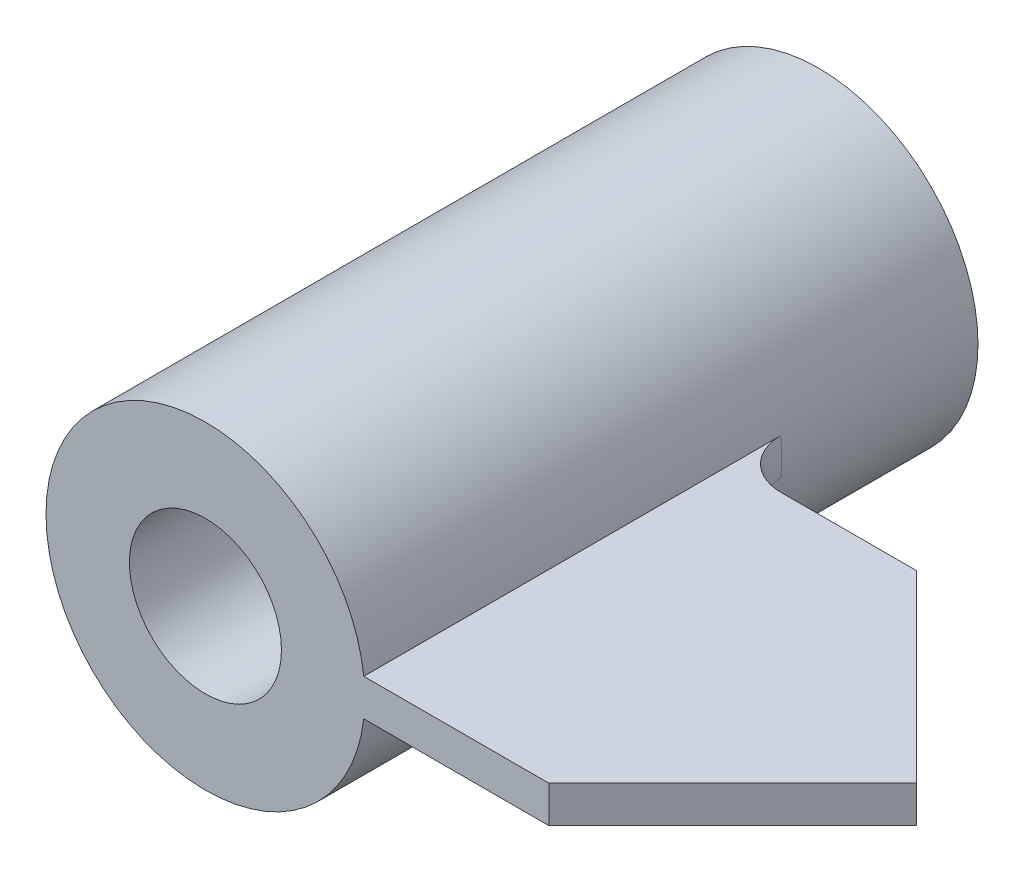
ISO-10303-21;
HEADER;
FILE_DESCRIPTION(('STEP AP214'),'2;1');
FILE_NAME('part.step','',(''),(''),'','','');
FILE_SCHEMA(('AUTOMOTIVE_DESIGN { 1 0 10303 214 1 1 1 1 }'));
ENDSEC;
DATA;
#1=APPLICATION_CONTEXT('core data for automotive mechanical design processes');
#2=APPLICATION_PROTOCOL_DEFINITION('international standard','automotive_design',2000,#1);
#3=PRODUCT_CONTEXT('',#1,'mechanical');
#4=PRODUCT('Part','Part','',(#3));
#5=PRODUCT_RELATED_PRODUCT_CATEGORY('part','',(#4));
#6=PRODUCT_DEFINITION_FORMATION('','',#4);
#7=PRODUCT_DEFINITION_CONTEXT('part definition',#1,'design');
#8=PRODUCT_DEFINITION('design','',#6,#7);
#9=PRODUCT_DEFINITION_SHAPE('','',#8);
#10=(LENGTH_UNIT() NAMED_UNIT(*) SI_UNIT(.MILLI.,.METRE.));
#11=(NAMED_UNIT(*) PLANE_ANGLE_UNIT() SI_UNIT($,.RADIAN.));
#12=(NAMED_UNIT(*) SI_UNIT($,.STERADIAN.) SOLID_ANGLE_UNIT());
#13=UNCERTAINTY_MEASURE_WITH_UNIT(LENGTH_MEASURE(1.E-05),#10,'distance_accuracy_value','');
#14=(GEOMETRIC_REPRESENTATION_CONTEXT(3) GLOBAL_UNCERTAINTY_ASSIGNED_CONTEXT((#13)) GLOBAL_UNIT_ASSIGNED_CONTEXT((#10,
#11,#12)) REPRESENTATION_CONTEXT('',''));
#15=CARTESIAN_POINT('',(0.,0.,0.));
#16=DIRECTION('',(0.,0.,1.));
#17=DIRECTION('',(1.,0.,0.));
#18=AXIS2_PLACEMENT_3D('',#15,#16,#17);
#19=CARTESIAN_POINT('',(0.,0.,55.));
#20=DIRECTION('',(0.,0.,-1.));
#21=DIRECTION('',(-1.,0.,0.));
#22=AXIS2_PLACEMENT_3D('',#19,#20,#21);
#23=CYLINDRICAL_SURFACE('',#22,6.5);
#24=CARTESIAN_POINT('',(0.,0.,63.));
#25=DIRECTION('',(0.,0.,-1.));
#26=DIRECTION('',(-1.,0.,0.));
#27=AXIS2_PLACEMENT_3D('',#24,#25,#26);
#28=CIRCLE('',#27,6.5);
#29=CARTESIAN_POINT('',(6.45659939920817,0.749882789604303,63.));
#30=VERTEX_POINT('',#29);
#31=CARTESIAN_POINT('',(6.45658578507248,-0.750000000000005,63.));
#32=VERTEX_POINT('',#31);
#33=EDGE_CURVE('E122',#30,#32,#28,.T.);
#34=ORIENTED_EDGE('',*,*,#33,.T.);
#35=DIRECTION('',(0.,0.,-1.));
#36=VECTOR('',#35,1.);
#37=CARTESIAN_POINT('',(6.45658578507248,-0.750000000000005,55.));
#38=LINE('',#37,#36);
#39=CARTESIAN_POINT('',(6.45658578507248,-0.750000000000005,80.));
#40=VERTEX_POINT('',#39);
#41=EDGE_CURVE('E106',#32,#40,#38,.F.);
#42=ORIENTED_EDGE('',*,*,#41,.T.);
#43=CARTESIAN_POINT('',(0.,0.,80.));
#44=DIRECTION('',(0.,0.,1.));
#45=DIRECTION('',(1.,0.,0.));
#46=AXIS2_PLACEMENT_3D('',#43,#44,#45);
#47=CIRCLE('',#46,6.5);
#48=CARTESIAN_POINT('',(6.45659939920817,0.749882789604303,80.));
#49=VERTEX_POINT('',#48);
#50=EDGE_CURVE('E120',#49,#40,#47,.T.);
#51=ORIENTED_EDGE('',*,*,#50,.F.);
#52=DIRECTION('',(0.,0.,-1.));
#53=VECTOR('',#52,1.);
#54=CARTESIAN_POINT('',(6.45659939920817,0.749882789604303,55.));
#55=LINE('',#54,#53);
#56=EDGE_CURVE('E123',#49,#30,#55,.T.);
#57=ORIENTED_EDGE('',*,*,#56,.T.);
#58=EDGE_LOOP('',(#34,#42,#51,#57));
#59=FACE_BOUND('',#58,.T.);
#60=CARTESIAN_POINT('',(0.,0.,55.));
#61=DIRECTION('',(0.,0.,-1.));
#62=DIRECTION('',(-1.,0.,0.));
#63=AXIS2_PLACEMENT_3D('',#60,#61,#62);
#64=CIRCLE('',#63,6.5);
#65=CARTESIAN_POINT('',(-6.5,0.,55.));
#66=VERTEX_POINT('',#65);
#67=EDGE_CURVE('E146',#66,#66,#64,.T.);
#68=ORIENTED_EDGE('',*,*,#67,.F.);
#69=EDGE_LOOP('',(#68));
#70=FACE_BOUND('',#69,.T.);
#71=ADVANCED_FACE('F46',(#59,#70),#23,.T.);
#72=CARTESIAN_POINT('',(0.,0.,80.));
#73=DIRECTION('',(0.,0.,1.));
#74=DIRECTION('',(1.,0.,0.));
#75=AXIS2_PLACEMENT_3D('',#72,#73,#74);
#76=PLANE('',#75);
#77=DIRECTION('',(1.,0.,0.));
#78=VECTOR('',#77,1.);
#79=CARTESIAN_POINT('',(21.5,-0.750000000000002,80.));
#80=LINE('',#79,#78);
#81=CARTESIAN_POINT('',(14.,-0.750000000000003,80.));
#82=VERTEX_POINT('',#81);
#83=EDGE_CURVE('E103',#40,#82,#80,.T.);
#84=ORIENTED_EDGE('',*,*,#83,.T.);
#85=DIRECTION('',(0.,1.,0.));
#86=VECTOR('',#85,1.);
#87=CARTESIAN_POINT('',(14.,0.,80.));
#88=LINE('',#87,#86);
#89=CARTESIAN_POINT('',(14.,0.749882789604304,80.));
#90=VERTEX_POINT('',#89);
#91=EDGE_CURVE('E129',#82,#90,#88,.T.);
#92=ORIENTED_EDGE('',*,*,#91,.T.);
#93=DIRECTION('',(-1.,0.,0.));
#94=VECTOR('',#93,1.);
#95=CARTESIAN_POINT('',(21.5,0.749882789604305,80.));
#96=LINE('',#95,#94);
#97=EDGE_CURVE('E113',#90,#49,#96,.T.);
#98=ORIENTED_EDGE('',*,*,#97,.T.);
#99=ORIENTED_EDGE('',*,*,#50,.T.);
#100=EDGE_LOOP('',(#84,#92,#98,#99));
#101=FACE_BOUND('',#100,.T.);
#102=CARTESIAN_POINT('',(0.,0.,80.));
#103=DIRECTION('',(0.,0.,1.));
#104=DIRECTION('',(1.,0.,0.));
#105=AXIS2_PLACEMENT_3D('',#102,#103,#104);
#106=CIRCLE('',#105,3.1);
#107=CARTESIAN_POINT('',(3.1,0.,80.));
#108=VERTEX_POINT('',#107);
#109=EDGE_CURVE('E188',#108,#108,#106,.T.);
#110=ORIENTED_EDGE('',*,*,#109,.F.);
#111=EDGE_LOOP('',(#110));
#112=FACE_BOUND('',#111,.T.);
#113=ADVANCED_FACE('F125',(#101,#112),#76,.T.);
#114=CARTESIAN_POINT('',(21.5,-0.750000000000002,65.));
#115=DIRECTION('',(0.,-1.,0.));
#116=DIRECTION('',(1.,0.,0.));
#117=AXIS2_PLACEMENT_3D('',#114,#115,#116);
#118=PLANE('',#117);
#119=DIRECTION('',(-0.707106781186549,0.,-0.707106781186547));
#120=VECTOR('',#119,1.);
#121=CARTESIAN_POINT('',(17.75,-0.750000000000003,68.75));
#122=LINE('',#121,#120);
#123=CARTESIAN_POINT('',(14.,-0.750000000000003,65.));
#124=VERTEX_POINT('',#123);
#125=CARTESIAN_POINT('',(21.5,-0.750000000000002,72.5));
#126=VERTEX_POINT('',#125);
#127=EDGE_CURVE('E138',#124,#126,#122,.F.);
#128=ORIENTED_EDGE('',*,*,#127,.T.);
#129=DIRECTION('',(0.707106781186547,0.,-0.707106781186549));
#130=VECTOR('',#129,1.);
#131=CARTESIAN_POINT('',(25.25,-0.750000000000001,68.75));
#132=LINE('',#131,#130);
#133=EDGE_CURVE('E108',#126,#82,#132,.F.);
#134=ORIENTED_EDGE('',*,*,#133,.T.);
#135=ORIENTED_EDGE('',*,*,#83,.F.);
#136=ORIENTED_EDGE('',*,*,#41,.F.);
#137=CARTESIAN_POINT('',(6.45658578507248,-0.750000000000005,63.));
#138=CARTESIAN_POINT('',(6.456585895016,-0.750000000000005,63.0560199511624));
#139=CARTESIAN_POINT('',(6.45895679287373,-0.750000000000005,63.1120129419453));
#140=CARTESIAN_POINT('',(6.46841351466681,-0.750000000000005,63.2235956415496));
#141=CARTESIAN_POINT('',(6.47549903271538,-0.750000000000005,63.2791853762978));
#142=CARTESIAN_POINT('',(6.50375284683669,-0.750000000000005,63.4446307390919));
#143=CARTESIAN_POINT('',(6.53191863347822,-0.750000000000005,63.5533739931093));
#144=CARTESIAN_POINT('',(6.60609047779167,-0.750000000000005,63.7645789486701));
#145=CARTESIAN_POINT('',(6.65210361858612,-0.750000000000005,63.8670381375206));
#146=CARTESIAN_POINT('',(6.76061749712723,-0.750000000000005,64.0628165652593));
#147=CARTESIAN_POINT('',(6.82311645382108,-0.750000000000005,64.1561367899872));
#148=CARTESIAN_POINT('',(6.96303625893643,-0.750000000000005,64.3313409786712));
#149=CARTESIAN_POINT('',(7.04050719813571,-0.750000000000005,64.4131849149133));
#150=CARTESIAN_POINT('',(7.20803612323553,-0.750000000000005,64.5628147915133));
#151=CARTESIAN_POINT('',(7.29809675944917,-0.750000000000005,64.6305977643527));
#152=CARTESIAN_POINT('',(7.48881064938792,-0.750000000000005,64.7505779035188));
#153=CARTESIAN_POINT('',(7.58952431661966,-0.750000000000004,64.802678942414));
#154=CARTESIAN_POINT('',(7.79822943150194,-0.750000000000004,64.8892755182759));
#155=CARTESIAN_POINT('',(7.90621692882678,-0.750000000000004,64.9237805255339));
#156=CARTESIAN_POINT('',(8.09015172744773,-0.750000000000004,64.9659511133814));
#157=CARTESIAN_POINT('',(8.16497154279755,-0.750000000000004,64.9787098808429));
#158=CARTESIAN_POINT('',(8.31546626925198,-0.750000000000004,64.9957336912368));
#159=CARTESIAN_POINT('',(8.3911398565467,-0.750000000000004,65.0000104414957));
#160=CARTESIAN_POINT('',(8.46684711093805,-0.750000000000004,65.));
#161=B_SPLINE_CURVE_WITH_KNOTS('',3,(#137,#138,#139,#140,#141,#142,#143,#144,#145,#146,#147,
#148,#149,#150,#151,#152,#153,#154,#155,#156,#157,#158,#159,#160),.UNSPECIFIED.,.F.,.F.,(4,2,2,
2,2,2,2,2,2,2,2,4),(0.,0.167956217268491,0.335901538520614,0.671165884098674,1.00656342321577,
1.34192474233363,1.67842811366767,2.0150024308002,2.3535997320963,2.69201460542254,
2.91926439815595,3.14620030986883),.UNSPECIFIED.);
#162=CARTESIAN_POINT('',(8.46684711093805,-0.750000000000004,65.));
#163=VERTEX_POINT('',#162);
#164=EDGE_CURVE('E60',#32,#163,#161,.T.);
#165=ORIENTED_EDGE('',*,*,#164,.T.);
#166=DIRECTION('',(1.,0.,0.));
#167=VECTOR('',#166,1.);
#168=CARTESIAN_POINT('',(21.5,-0.750000000000002,65.));
#169=LINE('',#168,#167);
#170=EDGE_CURVE('E178',#163,#124,#169,.T.);
#171=ORIENTED_EDGE('',*,*,#170,.T.);
#172=EDGE_LOOP('',(#128,#134,#135,#136,#165,#171));
#173=FACE_BOUND('',#172,.T.);
#174=ADVANCED_FACE('F105',(#173),#118,.T.);
#175=CARTESIAN_POINT('',(21.5,0.749882789604305,65.));
#176=DIRECTION('',(0.,1.,0.));
#177=DIRECTION('',(-1.,0.,0.));
#178=AXIS2_PLACEMENT_3D('',#175,#176,#177);
#179=PLANE('',#178);
#180=ORIENTED_EDGE('',*,*,#97,.F.);
#181=DIRECTION('',(-0.707106781186547,0.,0.707106781186549));
#182=VECTOR('',#181,1.);
#183=CARTESIAN_POINT('',(25.25,0.749882789604306,68.75));
#184=LINE('',#183,#182);
#185=CARTESIAN_POINT('',(21.5,0.749882789604305,72.5));
#186=VERTEX_POINT('',#185);
#187=EDGE_CURVE('E136',#90,#186,#184,.F.);
#188=ORIENTED_EDGE('',*,*,#187,.T.);
#189=DIRECTION('',(0.707106781186549,0.,0.707106781186547));
#190=VECTOR('',#189,1.);
#191=CARTESIAN_POINT('',(17.75,0.749882789604305,68.75));
#192=LINE('',#191,#190);
#193=CARTESIAN_POINT('',(14.,0.749882789604304,65.));
#194=VERTEX_POINT('',#193);
#195=EDGE_CURVE('E131',#186,#194,#192,.F.);
#196=ORIENTED_EDGE('',*,*,#195,.T.);
#197=DIRECTION('',(-1.,0.,0.));
#198=VECTOR('',#197,1.);
#199=CARTESIAN_POINT('',(21.5,0.749882789604305,65.));
#200=LINE('',#199,#198);
#201=CARTESIAN_POINT('',(8.46685749270975,0.749882789604303,65.));
#202=VERTEX_POINT('',#201);
#203=EDGE_CURVE('E180',#194,#202,#200,.T.);
#204=ORIENTED_EDGE('',*,*,#203,.T.);
#205=CARTESIAN_POINT('',(8.46685749270975,0.749882789604303,65.));
#206=CARTESIAN_POINT('',(8.41012616543038,0.749882789604303,64.9999995340136));
#207=CARTESIAN_POINT('',(8.35342214879016,0.749882789604303,64.9976034725925));
#208=CARTESIAN_POINT('',(8.24041999840883,0.749882789604303,64.9880462569389));
#209=CARTESIAN_POINT('',(8.18412184468557,0.749882789604303,64.9808853389404));
#210=CARTESIAN_POINT('',(8.01653170826635,0.749882789604303,64.9523242751285));
#211=CARTESIAN_POINT('',(7.90636214433129,0.749882789604303,64.9238456296738));
#212=CARTESIAN_POINT('',(7.69236958664806,0.749882789604303,64.8488016322939));
#213=CARTESIAN_POINT('',(7.58854962209191,0.749882789604303,64.8022277244036));
#214=CARTESIAN_POINT('',(7.39021225824501,0.749882789604303,64.6923038455143));
#215=CARTESIAN_POINT('',(7.29569316847248,0.749882789604303,64.6289569308491));
#216=CARTESIAN_POINT('',(7.11873744388704,0.749882789604303,64.4873156415015));
#217=CARTESIAN_POINT('',(7.0362912874857,0.749882789604303,64.4090331595364));
#218=CARTESIAN_POINT('',(6.88576169049443,0.749882789604303,64.2396653437029));
#219=CARTESIAN_POINT('',(6.81768087890574,0.749882789604303,64.1485776714307));
#220=CARTESIAN_POINT('',(6.6981557009222,0.749882789604303,63.9566021671673));
#221=CARTESIAN_POINT('',(6.64664432836457,0.749882789604303,63.8557560084287));
#222=CARTESIAN_POINT('',(6.56142925946528,0.749882789604303,63.6468338011364));
#223=CARTESIAN_POINT('',(6.5277134999837,0.749882789604303,63.5387627062934));
#224=CARTESIAN_POINT('',(6.48784285396162,0.749882789604303,63.3583068804657));
#225=CARTESIAN_POINT('',(6.47613406639754,0.749882789604303,63.2871010564251));
#226=CARTESIAN_POINT('',(6.46051345512654,0.749882789604303,63.1439406441085));
#227=CARTESIAN_POINT('',(6.45659071845711,0.749882789604303,63.0719872461285));
#228=CARTESIAN_POINT('',(6.45659939920817,0.749882789604303,63.));
#229=B_SPLINE_CURVE_WITH_KNOTS('',3,(#205,#206,#207,#208,#209,#210,#211,#212,#213,#214,#215,
#216,#217,#218,#219,#220,#221,#222,#223,#224,#225,#226,#227,#228),.UNSPECIFIED.,.F.,.F.,(4,2,2,
2,2,2,2,2,2,2,2,4),(0.,0.170089231919791,0.34017003171935,0.679792855873611,1.01957645936085,
1.35929819091821,1.69875053339453,2.038264945254,2.37638859016255,2.71428273534266,
2.93037488569705,3.14616394588164),.UNSPECIFIED.);
#230=EDGE_CURVE('E12',#202,#30,#229,.T.);
#231=ORIENTED_EDGE('',*,*,#230,.T.);
#232=ORIENTED_EDGE('',*,*,#56,.F.);
#233=EDGE_LOOP('',(#180,#188,#196,#204,#231,#232));
#234=FACE_BOUND('',#233,.T.);
#235=ADVANCED_FACE('F156',(#234),#179,.T.);
#236=CARTESIAN_POINT('',(0.,0.,65.));
#237=DIRECTION('',(0.,0.,-1.));
#238=DIRECTION('',(-1.,0.,0.));
#239=AXIS2_PLACEMENT_3D('',#236,#237,#238);
#240=PLANE('',#239);
#241=ORIENTED_EDGE('',*,*,#170,.F.);
#242=CARTESIAN_POINT('',(0.,0.,65.));
#243=DIRECTION('',(0.,0.,-1.));
#244=DIRECTION('',(-1.,0.,0.));
#245=AXIS2_PLACEMENT_3D('',#242,#243,#244);
#246=CIRCLE('',#245,8.5);
#247=EDGE_CURVE('E73',#163,#202,#246,.F.);
#248=ORIENTED_EDGE('',*,*,#247,.T.);
#249=ORIENTED_EDGE('',*,*,#203,.F.);
#250=DIRECTION('',(0.,-1.,0.));
#251=VECTOR('',#250,1.);
#252=CARTESIAN_POINT('',(14.,0.,65.));
#253=LINE('',#252,#251);
#254=EDGE_CURVE('E141',#194,#124,#253,.T.);
#255=ORIENTED_EDGE('',*,*,#254,.T.);
#256=EDGE_LOOP('',(#241,#248,#249,#255));
#257=FACE_BOUND('',#256,.T.);
#258=ADVANCED_FACE('F168',(#257),#240,.T.);
#259=CARTESIAN_POINT('',(21.5,-0.750000000000002,72.5));
#260=DIRECTION('',(-0.707106781186546,0.,0.707106781186548));
#261=DIRECTION('',(0.,1.,0.));
#262=AXIS2_PLACEMENT_3D('',#259,#260,#261);
#263=PLANE('',#262);
#264=DIRECTION('',(0.,1.,0.));
#265=VECTOR('',#264,1.);
#266=CARTESIAN_POINT('',(21.5,-0.750000000000002,72.5));
#267=LINE('',#266,#265);
#268=EDGE_CURVE('E114',#126,#186,#267,.T.);
#269=ORIENTED_EDGE('',*,*,#268,.F.);
#270=ORIENTED_EDGE('',*,*,#127,.F.);
#271=ORIENTED_EDGE('',*,*,#254,.F.);
#272=ORIENTED_EDGE('',*,*,#195,.F.);
#273=EDGE_LOOP('',(#269,#270,#271,#272));
#274=FACE_BOUND('',#273,.T.);
#275=ADVANCED_FACE('F165',(#274),#263,.F.);
#276=CARTESIAN_POINT('',(14.,0.,80.));
#277=DIRECTION('',(-0.707106781186549,0.,-0.707106781186547));
#278=DIRECTION('',(0.,1.,0.));
#279=AXIS2_PLACEMENT_3D('',#276,#277,#278);
#280=PLANE('',#279);
#281=ORIENTED_EDGE('',*,*,#133,.F.);
#282=ORIENTED_EDGE('',*,*,#268,.T.);
#283=ORIENTED_EDGE('',*,*,#187,.F.);
#284=ORIENTED_EDGE('',*,*,#91,.F.);
#285=EDGE_LOOP('',(#281,#282,#283,#284));
#286=FACE_BOUND('',#285,.T.);
#287=ADVANCED_FACE('F163',(#286),#280,.F.);
#288=CARTESIAN_POINT('',(0.,0.,63.));
#289=DIRECTION('',(0.,0.,-1.));
#290=DIRECTION('',(-1.,0.,0.));
#291=AXIS2_PLACEMENT_3D('',#288,#289,#290);
#292=TOROIDAL_SURFACE('',#291,8.5,2.);
#293=ORIENTED_EDGE('',*,*,#230,.F.);
#294=ORIENTED_EDGE('',*,*,#247,.F.);
#295=ORIENTED_EDGE('',*,*,#164,.F.);
#296=ORIENTED_EDGE('',*,*,#33,.F.);
#297=EDGE_LOOP('',(#293,#294,#295,#296));
#298=FACE_BOUND('',#297,.T.);
#299=ADVANCED_FACE('F48',(#298),#292,.F.);
#300=CARTESIAN_POINT('',(0.,0.,55.));
#301=DIRECTION('',(0.,0.,-1.));
#302=DIRECTION('',(-1.,0.,0.));
#303=AXIS2_PLACEMENT_3D('',#300,#301,#302);
#304=PLANE('',#303);
#305=ORIENTED_EDGE('',*,*,#67,.T.);
#306=EDGE_LOOP('',(#305));
#307=FACE_BOUND('',#306,.T.);
#308=CARTESIAN_POINT('',(0.,0.,55.));
#309=DIRECTION('',(0.,0.,1.));
#310=DIRECTION('',(1.,0.,0.));
#311=AXIS2_PLACEMENT_3D('',#308,#309,#310);
#312=CIRCLE('',#311,3.1);
#313=CARTESIAN_POINT('',(3.1,0.,55.));
#314=VERTEX_POINT('',#313);
#315=EDGE_CURVE('E187',#314,#314,#312,.T.);
#316=ORIENTED_EDGE('',*,*,#315,.T.);
#317=EDGE_LOOP('',(#316));
#318=FACE_BOUND('',#317,.T.);
#319=ADVANCED_FACE('F194',(#307,#318),#304,.T.);
#320=CARTESIAN_POINT('',(0.,0.,55.));
#321=DIRECTION('',(0.,0.,1.));
#322=DIRECTION('',(1.,0.,0.));
#323=AXIS2_PLACEMENT_3D('',#320,#321,#322);
#324=CYLINDRICAL_SURFACE('',#323,3.1);
#325=ORIENTED_EDGE('',*,*,#315,.F.);
#326=EDGE_LOOP('',(#325));
#327=FACE_BOUND('',#326,.T.);
#328=ORIENTED_EDGE('',*,*,#109,.T.);
#329=EDGE_LOOP('',(#328));
#330=FACE_BOUND('',#329,.T.);
#331=ADVANCED_FACE('F196',(#327,#330),#324,.F.);
#332=CLOSED_SHELL('',(#71,#113,#174,#235,#258,#275,#287,#299,#319,#331));
#333=MANIFOLD_SOLID_BREP('B2',#332);
#334=ADVANCED_BREP_SHAPE_REPRESENTATION('',(#18,#333),#14);
#335=SHAPE_DEFINITION_REPRESENTATION(#9,#334);
ENDSEC;
END-ISO-10303-21;
